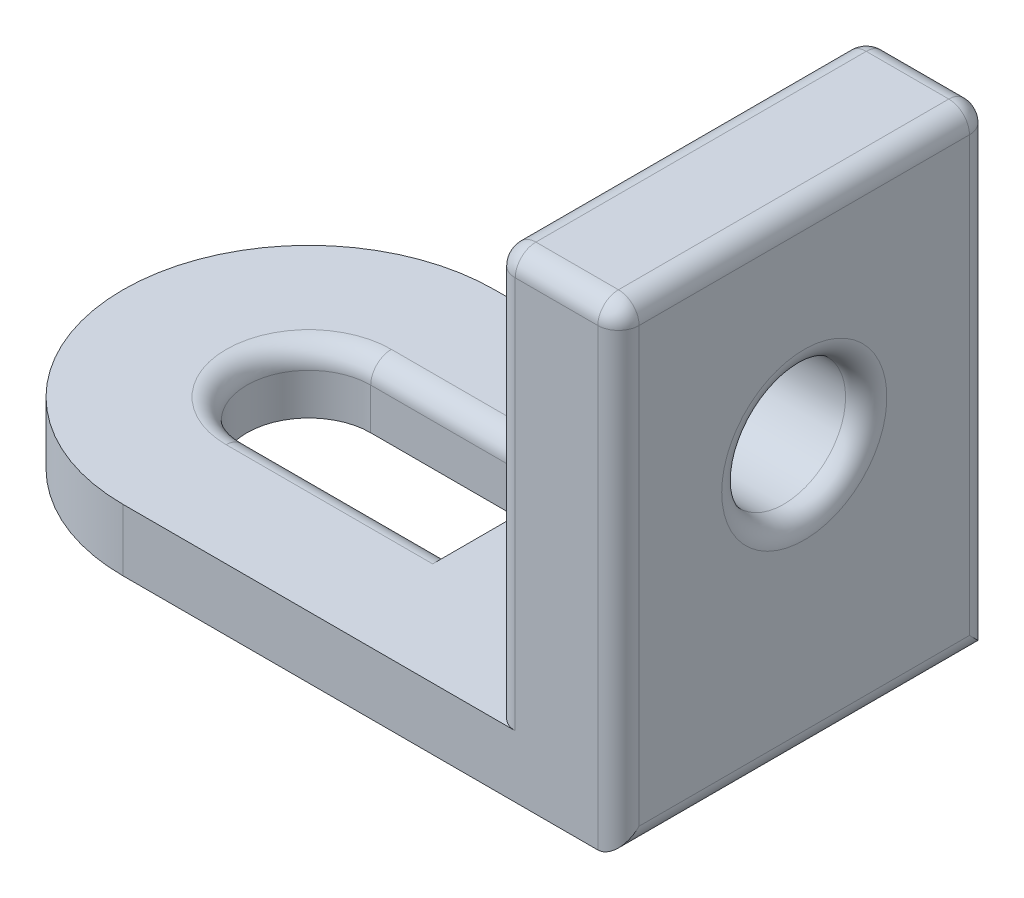
ISO-10303-21;
HEADER;
FILE_DESCRIPTION(('STEP AP214'),'2;1');
FILE_NAME('part.step','',(''),(''),'','','');
FILE_SCHEMA(('AUTOMOTIVE_DESIGN { 1 0 10303 214 1 1 1 1 }'));
ENDSEC;
DATA;
#1=APPLICATION_CONTEXT('core data for automotive mechanical design processes');
#2=APPLICATION_PROTOCOL_DEFINITION('international standard','automotive_design',2000,#1);
#3=PRODUCT_CONTEXT('',#1,'mechanical');
#4=PRODUCT('Part','Part','',(#3));
#5=PRODUCT_RELATED_PRODUCT_CATEGORY('part','',(#4));
#6=PRODUCT_DEFINITION_FORMATION('','',#4);
#7=PRODUCT_DEFINITION_CONTEXT('part definition',#1,'design');
#8=PRODUCT_DEFINITION('design','',#6,#7);
#9=PRODUCT_DEFINITION_SHAPE('','',#8);
#10=(LENGTH_UNIT() NAMED_UNIT(*) SI_UNIT(.MILLI.,.METRE.));
#11=(NAMED_UNIT(*) PLANE_ANGLE_UNIT() SI_UNIT($,.RADIAN.));
#12=(NAMED_UNIT(*) SI_UNIT($,.STERADIAN.) SOLID_ANGLE_UNIT());
#13=UNCERTAINTY_MEASURE_WITH_UNIT(LENGTH_MEASURE(1.E-05),#10,'distance_accuracy_value','');
#14=(GEOMETRIC_REPRESENTATION_CONTEXT(3) GLOBAL_UNCERTAINTY_ASSIGNED_CONTEXT((#13)) GLOBAL_UNIT_ASSIGNED_CONTEXT((#10,
#11,#12)) REPRESENTATION_CONTEXT('',''));
#15=CARTESIAN_POINT('',(0.,0.,0.));
#16=DIRECTION('',(0.,0.,1.));
#17=DIRECTION('',(1.,0.,0.));
#18=AXIS2_PLACEMENT_3D('',#15,#16,#17);
#19=CARTESIAN_POINT('',(24.,3.,-9.));
#20=DIRECTION('',(-1.,0.,0.));
#21=DIRECTION('',(0.,0.,1.));
#22=AXIS2_PLACEMENT_3D('',#19,#20,#21);
#23=PLANE('',#22);
#24=CARTESIAN_POINT('',(24.,13.,0.));
#25=DIRECTION('',(-1.,0.,0.));
#26=DIRECTION('',(0.,0.,1.));
#27=AXIS2_PLACEMENT_3D('',#24,#25,#26);
#28=CIRCLE('',#27,4.);
#29=CARTESIAN_POINT('',(24.,13.,4.));
#30=VERTEX_POINT('',#29);
#31=EDGE_CURVE('E11',#30,#30,#28,.T.);
#32=ORIENTED_EDGE('',*,*,#31,.T.);
#33=EDGE_LOOP('',(#32));
#34=FACE_BOUND('',#33,.T.);
#35=DIRECTION('',(0.,-1.,0.));
#36=VECTOR('',#35,1.);
#37=CARTESIAN_POINT('',(24.,3.,-8.));
#38=LINE('',#37,#36);
#39=CARTESIAN_POINT('',(24.,1.,-8.));
#40=VERTEX_POINT('',#39);
#41=CARTESIAN_POINT('',(24.,22.,-8.));
#42=VERTEX_POINT('',#41);
#43=EDGE_CURVE('E206',#40,#42,#38,.F.);
#44=ORIENTED_EDGE('',*,*,#43,.T.);
#45=DIRECTION('',(0.,0.,-1.));
#46=VECTOR('',#45,1.);
#47=CARTESIAN_POINT('',(24.,22.,-9.));
#48=LINE('',#47,#46);
#49=CARTESIAN_POINT('',(24.,22.,8.));
#50=VERTEX_POINT('',#49);
#51=EDGE_CURVE('E438',#42,#50,#48,.F.);
#52=ORIENTED_EDGE('',*,*,#51,.T.);
#53=DIRECTION('',(0.,-1.,0.));
#54=VECTOR('',#53,1.);
#55=CARTESIAN_POINT('',(24.,3.,8.));
#56=LINE('',#55,#54);
#57=CARTESIAN_POINT('',(24.,1.,8.));
#58=VERTEX_POINT('',#57);
#59=EDGE_CURVE('E230',#50,#58,#56,.T.);
#60=ORIENTED_EDGE('',*,*,#59,.T.);
#61=DIRECTION('',(0.,0.,-1.));
#62=VECTOR('',#61,1.);
#63=CARTESIAN_POINT('',(24.,1.,-9.));
#64=LINE('',#63,#62);
#65=EDGE_CURVE('E225',#58,#40,#64,.T.);
#66=ORIENTED_EDGE('',*,*,#65,.T.);
#67=EDGE_LOOP('',(#44,#52,#60,#66));
#68=FACE_BOUND('',#67,.T.);
#69=ADVANCED_FACE('F35',(#34,#68),#23,.F.);
#70=CARTESIAN_POINT('',(0.,3.,-9.));
#71=DIRECTION('',(0.,0.,1.));
#72=DIRECTION('',(1.,0.,0.));
#73=AXIS2_PLACEMENT_3D('',#70,#71,#72);
#74=PLANE('',#73);
#75=DIRECTION('',(-1.,0.,0.));
#76=VECTOR('',#75,1.);
#77=CARTESIAN_POINT('',(0.,3.,-9.));
#78=LINE('',#77,#76);
#79=CARTESIAN_POINT('',(19.,3.,-9.));
#80=VERTEX_POINT('',#79);
#81=CARTESIAN_POINT('',(0.,3.,-9.));
#82=VERTEX_POINT('',#81);
#83=EDGE_CURVE('E197',#80,#82,#78,.T.);
#84=ORIENTED_EDGE('',*,*,#83,.F.);
#85=DIRECTION('',(0.,-1.,0.));
#86=VECTOR('',#85,1.);
#87=CARTESIAN_POINT('',(19.,3.,-9.));
#88=LINE('',#87,#86);
#89=CARTESIAN_POINT('',(19.,22.,-9.));
#90=VERTEX_POINT('',#89);
#91=EDGE_CURVE('E473',#80,#90,#88,.F.);
#92=ORIENTED_EDGE('',*,*,#91,.T.);
#93=DIRECTION('',(-1.,0.,0.));
#94=VECTOR('',#93,1.);
#95=CARTESIAN_POINT('',(0.,22.,-9.));
#96=LINE('',#95,#94);
#97=CARTESIAN_POINT('',(23.,22.,-9.));
#98=VERTEX_POINT('',#97);
#99=EDGE_CURVE('E477',#90,#98,#96,.F.);
#100=ORIENTED_EDGE('',*,*,#99,.T.);
#101=DIRECTION('',(0.,-1.,0.));
#102=VECTOR('',#101,1.);
#103=CARTESIAN_POINT('',(23.,3.,-9.));
#104=LINE('',#103,#102);
#105=CARTESIAN_POINT('',(23.,0.,-9.));
#106=VERTEX_POINT('',#105);
#107=EDGE_CURVE('E239',#98,#106,#104,.T.);
#108=ORIENTED_EDGE('',*,*,#107,.T.);
#109=DIRECTION('',(-1.,0.,0.));
#110=VECTOR('',#109,1.);
#111=CARTESIAN_POINT('',(0.,0.,-9.));
#112=LINE('',#111,#110);
#113=CARTESIAN_POINT('',(0.,0.,-9.));
#114=VERTEX_POINT('',#113);
#115=EDGE_CURVE('E168',#106,#114,#112,.T.);
#116=ORIENTED_EDGE('',*,*,#115,.T.);
#117=DIRECTION('',(0.,-1.,0.));
#118=VECTOR('',#117,1.);
#119=CARTESIAN_POINT('',(0.,3.,-9.));
#120=LINE('',#119,#118);
#121=EDGE_CURVE('E201',#82,#114,#120,.T.);
#122=ORIENTED_EDGE('',*,*,#121,.F.);
#123=EDGE_LOOP('',(#84,#92,#100,#108,#116,#122));
#124=FACE_BOUND('',#123,.T.);
#125=ADVANCED_FACE('F322',(#124),#74,.F.);
#126=CARTESIAN_POINT('',(0.,3.,0.));
#127=DIRECTION('',(0.,-1.,0.));
#128=DIRECTION('',(0.,0.,-1.));
#129=AXIS2_PLACEMENT_3D('',#126,#127,#128);
#130=CYLINDRICAL_SURFACE('',#129,9.);
#131=CARTESIAN_POINT('',(0.,0.,0.));
#132=DIRECTION('',(0.,1.,0.));
#133=DIRECTION('',(0.,0.,1.));
#134=AXIS2_PLACEMENT_3D('',#131,#132,#133);
#135=CIRCLE('',#134,9.);
#136=CARTESIAN_POINT('',(0.,0.,9.));
#137=VERTEX_POINT('',#136);
#138=EDGE_CURVE('E211',#114,#137,#135,.T.);
#139=ORIENTED_EDGE('',*,*,#138,.T.);
#140=DIRECTION('',(0.,-1.,0.));
#141=VECTOR('',#140,1.);
#142=CARTESIAN_POINT('',(0.,3.,9.));
#143=LINE('',#142,#141);
#144=CARTESIAN_POINT('',(0.,3.,9.));
#145=VERTEX_POINT('',#144);
#146=EDGE_CURVE('E205',#145,#137,#143,.T.);
#147=ORIENTED_EDGE('',*,*,#146,.F.);
#148=CARTESIAN_POINT('',(0.,3.,0.));
#149=DIRECTION('',(0.,1.,0.));
#150=DIRECTION('',(0.,0.,1.));
#151=AXIS2_PLACEMENT_3D('',#148,#149,#150);
#152=CIRCLE('',#151,9.);
#153=EDGE_CURVE('E194',#82,#145,#152,.T.);
#154=ORIENTED_EDGE('',*,*,#153,.F.);
#155=ORIENTED_EDGE('',*,*,#121,.T.);
#156=EDGE_LOOP('',(#139,#147,#154,#155));
#157=FACE_BOUND('',#156,.T.);
#158=ADVANCED_FACE('F329',(#157),#130,.T.);
#159=CARTESIAN_POINT('',(0.,3.,9.));
#160=DIRECTION('',(0.,0.,-1.));
#161=DIRECTION('',(-1.,0.,0.));
#162=AXIS2_PLACEMENT_3D('',#159,#160,#161);
#163=PLANE('',#162);
#164=DIRECTION('',(0.,-1.,0.));
#165=VECTOR('',#164,1.);
#166=CARTESIAN_POINT('',(19.,3.,9.));
#167=LINE('',#166,#165);
#168=CARTESIAN_POINT('',(19.,22.,9.));
#169=VERTEX_POINT('',#168);
#170=CARTESIAN_POINT('',(19.,3.,9.));
#171=VERTEX_POINT('',#170);
#172=EDGE_CURVE('E254',#169,#171,#167,.T.);
#173=ORIENTED_EDGE('',*,*,#172,.T.);
#174=DIRECTION('',(1.,0.,0.));
#175=VECTOR('',#174,1.);
#176=CARTESIAN_POINT('',(0.,3.,9.));
#177=LINE('',#176,#175);
#178=EDGE_CURVE('E203',#145,#171,#177,.T.);
#179=ORIENTED_EDGE('',*,*,#178,.F.);
#180=ORIENTED_EDGE('',*,*,#146,.T.);
#181=DIRECTION('',(1.,0.,0.));
#182=VECTOR('',#181,1.);
#183=CARTESIAN_POINT('',(0.,0.,9.));
#184=LINE('',#183,#182);
#185=CARTESIAN_POINT('',(23.,0.,9.));
#186=VERTEX_POINT('',#185);
#187=EDGE_CURVE('E200',#137,#186,#184,.T.);
#188=ORIENTED_EDGE('',*,*,#187,.T.);
#189=DIRECTION('',(0.,-1.,0.));
#190=VECTOR('',#189,1.);
#191=CARTESIAN_POINT('',(23.,3.,9.));
#192=LINE('',#191,#190);
#193=CARTESIAN_POINT('',(23.,22.,9.));
#194=VERTEX_POINT('',#193);
#195=EDGE_CURVE('E236',#186,#194,#192,.F.);
#196=ORIENTED_EDGE('',*,*,#195,.T.);
#197=DIRECTION('',(1.,0.,0.));
#198=VECTOR('',#197,1.);
#199=CARTESIAN_POINT('',(0.,22.,9.));
#200=LINE('',#199,#198);
#201=EDGE_CURVE('E252',#194,#169,#200,.F.);
#202=ORIENTED_EDGE('',*,*,#201,.T.);
#203=EDGE_LOOP('',(#173,#179,#180,#188,#196,#202));
#204=FACE_BOUND('',#203,.T.);
#205=ADVANCED_FACE('F403',(#204),#163,.F.);
#206=CARTESIAN_POINT('',(0.,3.,0.));
#207=DIRECTION('',(0.,1.,0.));
#208=DIRECTION('',(0.,0.,1.));
#209=AXIS2_PLACEMENT_3D('',#206,#207,#208);
#210=PLANE('',#209);
#211=DIRECTION('',(0.,0.,1.));
#212=VECTOR('',#211,1.);
#213=CARTESIAN_POINT('',(18.,3.,-9.));
#214=LINE('',#213,#212);
#215=CARTESIAN_POINT('',(18.,3.,-8.));
#216=VERTEX_POINT('',#215);
#217=CARTESIAN_POINT('',(18.,3.,8.));
#218=VERTEX_POINT('',#217);
#219=EDGE_CURVE('E185',#216,#218,#214,.T.);
#220=ORIENTED_EDGE('',*,*,#219,.F.);
#221=CARTESIAN_POINT('',(19.,3.,-8.));
#222=DIRECTION('',(0.,1.,0.));
#223=DIRECTION('',(0.,0.,1.));
#224=AXIS2_PLACEMENT_3D('',#221,#222,#223);
#225=CIRCLE('',#224,1.);
#226=EDGE_CURVE('E281',#216,#80,#225,.F.);
#227=ORIENTED_EDGE('',*,*,#226,.T.);
#228=ORIENTED_EDGE('',*,*,#83,.T.);
#229=ORIENTED_EDGE('',*,*,#153,.T.);
#230=ORIENTED_EDGE('',*,*,#178,.T.);
#231=CARTESIAN_POINT('',(19.,3.,8.));
#232=DIRECTION('',(0.,1.,0.));
#233=DIRECTION('',(0.,0.,1.));
#234=AXIS2_PLACEMENT_3D('',#231,#232,#233);
#235=CIRCLE('',#234,1.);
#236=EDGE_CURVE('E286',#171,#218,#235,.F.);
#237=ORIENTED_EDGE('',*,*,#236,.T.);
#238=EDGE_LOOP('',(#220,#227,#228,#229,#230,#237));
#239=FACE_BOUND('',#238,.T.);
#240=DIRECTION('',(-1.,0.,0.));
#241=VECTOR('',#240,1.);
#242=CARTESIAN_POINT('',(10.,3.,-4.));
#243=LINE('',#242,#241);
#244=CARTESIAN_POINT('',(0.,3.,-4.));
#245=VERTEX_POINT('',#244);
#246=CARTESIAN_POINT('',(10.,3.,-4.));
#247=VERTEX_POINT('',#246);
#248=EDGE_CURVE('E292',#245,#247,#243,.F.);
#249=ORIENTED_EDGE('',*,*,#248,.T.);
#250=DIRECTION('',(0.,0.,-1.));
#251=VECTOR('',#250,1.);
#252=CARTESIAN_POINT('',(10.,3.,-3.));
#253=LINE('',#252,#251);
#254=CARTESIAN_POINT('',(10.,3.,4.));
#255=VERTEX_POINT('',#254);
#256=EDGE_CURVE('E173',#255,#247,#253,.T.);
#257=ORIENTED_EDGE('',*,*,#256,.F.);
#258=DIRECTION('',(1.,0.,0.));
#259=VECTOR('',#258,1.);
#260=CARTESIAN_POINT('',(0.,3.,4.));
#261=LINE('',#260,#259);
#262=CARTESIAN_POINT('',(0.,3.,4.));
#263=VERTEX_POINT('',#262);
#264=EDGE_CURVE('E283',#255,#263,#261,.F.);
#265=ORIENTED_EDGE('',*,*,#264,.T.);
#266=CARTESIAN_POINT('',(0.,3.,0.));
#267=DIRECTION('',(0.,1.,0.));
#268=DIRECTION('',(0.,0.,1.));
#269=AXIS2_PLACEMENT_3D('',#266,#267,#268);
#270=CIRCLE('',#269,4.);
#271=EDGE_CURVE('E280',#263,#245,#270,.F.);
#272=ORIENTED_EDGE('',*,*,#271,.T.);
#273=EDGE_LOOP('',(#249,#257,#265,#272));
#274=FACE_BOUND('',#273,.T.);
#275=ADVANCED_FACE('F400',(#239,#274),#210,.T.);
#276=CARTESIAN_POINT('',(0.,0.,0.));
#277=DIRECTION('',(0.,1.,0.));
#278=DIRECTION('',(0.,0.,1.));
#279=AXIS2_PLACEMENT_3D('',#276,#277,#278);
#280=PLANE('',#279);
#281=DIRECTION('',(1.,0.,0.));
#282=VECTOR('',#281,1.);
#283=CARTESIAN_POINT('',(0.,0.,-3.));
#284=LINE('',#283,#282);
#285=CARTESIAN_POINT('',(0.,0.,-3.));
#286=VERTEX_POINT('',#285);
#287=CARTESIAN_POINT('',(10.,0.,-3.));
#288=VERTEX_POINT('',#287);
#289=EDGE_CURVE('E178',#286,#288,#284,.T.);
#290=ORIENTED_EDGE('',*,*,#289,.F.);
#291=CARTESIAN_POINT('',(0.,0.,0.));
#292=DIRECTION('',(0.,1.,0.));
#293=DIRECTION('',(0.,0.,1.));
#294=AXIS2_PLACEMENT_3D('',#291,#292,#293);
#295=CIRCLE('',#294,3.);
#296=CARTESIAN_POINT('',(0.,0.,3.));
#297=VERTEX_POINT('',#296);
#298=EDGE_CURVE('E169',#297,#286,#295,.F.);
#299=ORIENTED_EDGE('',*,*,#298,.F.);
#300=DIRECTION('',(-1.,0.,0.));
#301=VECTOR('',#300,1.);
#302=CARTESIAN_POINT('',(0.,0.,3.));
#303=LINE('',#302,#301);
#304=CARTESIAN_POINT('',(10.,0.,3.));
#305=VERTEX_POINT('',#304);
#306=EDGE_CURVE('E160',#305,#297,#303,.T.);
#307=ORIENTED_EDGE('',*,*,#306,.F.);
#308=DIRECTION('',(0.,0.,1.));
#309=VECTOR('',#308,1.);
#310=CARTESIAN_POINT('',(10.,0.,-3.));
#311=LINE('',#310,#309);
#312=EDGE_CURVE('E180',#288,#305,#311,.T.);
#313=ORIENTED_EDGE('',*,*,#312,.F.);
#314=EDGE_LOOP('',(#290,#299,#307,#313));
#315=FACE_BOUND('',#314,.T.);
#316=ORIENTED_EDGE('',*,*,#115,.F.);
#317=DIRECTION('',(0.,0.,-1.));
#318=VECTOR('',#317,1.);
#319=CARTESIAN_POINT('',(23.,0.,0.));
#320=LINE('',#319,#318);
#321=EDGE_CURVE('E232',#106,#186,#320,.F.);
#322=ORIENTED_EDGE('',*,*,#321,.T.);
#323=ORIENTED_EDGE('',*,*,#187,.F.);
#324=ORIENTED_EDGE('',*,*,#138,.F.);
#325=EDGE_LOOP('',(#316,#322,#323,#324));
#326=FACE_BOUND('',#325,.T.);
#327=ADVANCED_FACE('F176',(#315,#326),#280,.F.);
#328=CARTESIAN_POINT('',(0.,-14.3178210632764,0.));
#329=DIRECTION('',(0.,1.,0.));
#330=DIRECTION('',(0.,0.,1.));
#331=AXIS2_PLACEMENT_3D('',#328,#329,#330);
#332=CYLINDRICAL_SURFACE('',#331,3.);
#333=DIRECTION('',(0.,1.,0.));
#334=VECTOR('',#333,1.);
#335=CARTESIAN_POINT('',(0.,-14.3178210632764,-3.));
#336=LINE('',#335,#334);
#337=CARTESIAN_POINT('',(0.,2.,-3.));
#338=VERTEX_POINT('',#337);
#339=EDGE_CURVE('E186',#286,#338,#336,.T.);
#340=ORIENTED_EDGE('',*,*,#339,.T.);
#341=CARTESIAN_POINT('',(0.,2.,0.));
#342=DIRECTION('',(0.,1.,0.));
#343=DIRECTION('',(0.,0.,1.));
#344=AXIS2_PLACEMENT_3D('',#341,#342,#343);
#345=CIRCLE('',#344,3.);
#346=CARTESIAN_POINT('',(0.,2.,3.));
#347=VERTEX_POINT('',#346);
#348=EDGE_CURVE('E58',#338,#347,#345,.T.);
#349=ORIENTED_EDGE('',*,*,#348,.T.);
#350=DIRECTION('',(0.,1.,0.));
#351=VECTOR('',#350,1.);
#352=CARTESIAN_POINT('',(0.,-14.3178210632764,3.));
#353=LINE('',#352,#351);
#354=EDGE_CURVE('E162',#297,#347,#353,.T.);
#355=ORIENTED_EDGE('',*,*,#354,.F.);
#356=ORIENTED_EDGE('',*,*,#298,.T.);
#357=EDGE_LOOP('',(#340,#349,#355,#356));
#358=FACE_BOUND('',#357,.T.);
#359=ADVANCED_FACE('F171',(#358),#332,.F.);
#360=CARTESIAN_POINT('',(0.,-14.3178210632764,-3.));
#361=DIRECTION('',(0.,0.,-1.));
#362=DIRECTION('',(-1.,0.,0.));
#363=AXIS2_PLACEMENT_3D('',#360,#361,#362);
#364=PLANE('',#363);
#365=DIRECTION('',(0.,1.,0.));
#366=VECTOR('',#365,1.);
#367=CARTESIAN_POINT('',(10.,-14.3178210632764,-3.));
#368=LINE('',#367,#366);
#369=CARTESIAN_POINT('',(10.,2.,-3.));
#370=VERTEX_POINT('',#369);
#371=EDGE_CURVE('E188',#288,#370,#368,.T.);
#372=ORIENTED_EDGE('',*,*,#371,.T.);
#373=DIRECTION('',(-1.,0.,0.));
#374=VECTOR('',#373,1.);
#375=CARTESIAN_POINT('',(0.,2.,-3.));
#376=LINE('',#375,#374);
#377=EDGE_CURVE('E274',#370,#338,#376,.T.);
#378=ORIENTED_EDGE('',*,*,#377,.T.);
#379=ORIENTED_EDGE('',*,*,#339,.F.);
#380=ORIENTED_EDGE('',*,*,#289,.T.);
#381=EDGE_LOOP('',(#372,#378,#379,#380));
#382=FACE_BOUND('',#381,.T.);
#383=ADVANCED_FACE('F273',(#382),#364,.F.);
#384=CARTESIAN_POINT('',(10.,-14.3178210632764,-3.));
#385=DIRECTION('',(1.,0.,0.));
#386=DIRECTION('',(0.,0.,-1.));
#387=AXIS2_PLACEMENT_3D('',#384,#385,#386);
#388=PLANE('',#387);
#389=ORIENTED_EDGE('',*,*,#312,.T.);
#390=DIRECTION('',(0.,1.,0.));
#391=VECTOR('',#390,1.);
#392=CARTESIAN_POINT('',(10.,-14.3178210632764,3.));
#393=LINE('',#392,#391);
#394=CARTESIAN_POINT('',(10.,2.,3.));
#395=VERTEX_POINT('',#394);
#396=EDGE_CURVE('E163',#305,#395,#393,.T.);
#397=ORIENTED_EDGE('',*,*,#396,.T.);
#398=CARTESIAN_POINT('',(10.,2.,4.));
#399=DIRECTION('',(1.,0.,0.));
#400=DIRECTION('',(0.,0.,-1.));
#401=AXIS2_PLACEMENT_3D('',#398,#399,#400);
#402=CIRCLE('',#401,1.);
#403=EDGE_CURVE('E298',#395,#255,#402,.T.);
#404=ORIENTED_EDGE('',*,*,#403,.T.);
#405=ORIENTED_EDGE('',*,*,#256,.T.);
#406=CARTESIAN_POINT('',(10.,2.,-4.));
#407=DIRECTION('',(1.,0.,0.));
#408=DIRECTION('',(0.,0.,-1.));
#409=AXIS2_PLACEMENT_3D('',#406,#407,#408);
#410=CIRCLE('',#409,1.);
#411=EDGE_CURVE('E269',#247,#370,#410,.T.);
#412=ORIENTED_EDGE('',*,*,#411,.T.);
#413=ORIENTED_EDGE('',*,*,#371,.F.);
#414=EDGE_LOOP('',(#389,#397,#404,#405,#412,#413));
#415=FACE_BOUND('',#414,.T.);
#416=ADVANCED_FACE('F265',(#415),#388,.F.);
#417=CARTESIAN_POINT('',(0.,-14.3178210632764,3.));
#418=DIRECTION('',(0.,0.,1.));
#419=DIRECTION('',(1.,0.,0.));
#420=AXIS2_PLACEMENT_3D('',#417,#418,#419);
#421=PLANE('',#420);
#422=ORIENTED_EDGE('',*,*,#354,.T.);
#423=DIRECTION('',(1.,0.,0.));
#424=VECTOR('',#423,1.);
#425=CARTESIAN_POINT('',(10.,2.,3.));
#426=LINE('',#425,#424);
#427=EDGE_CURVE('E50',#347,#395,#426,.T.);
#428=ORIENTED_EDGE('',*,*,#427,.T.);
#429=ORIENTED_EDGE('',*,*,#396,.F.);
#430=ORIENTED_EDGE('',*,*,#306,.T.);
#431=EDGE_LOOP('',(#422,#428,#429,#430));
#432=FACE_BOUND('',#431,.T.);
#433=ADVANCED_FACE('F161',(#432),#421,.F.);
#434=CARTESIAN_POINT('',(18.,23.,-9.));
#435=DIRECTION('',(1.,0.,0.));
#436=DIRECTION('',(0.,0.,-1.));
#437=AXIS2_PLACEMENT_3D('',#434,#435,#436);
#438=PLANE('',#437);
#439=CARTESIAN_POINT('',(18.,13.,0.));
#440=DIRECTION('',(1.,0.,0.));
#441=DIRECTION('',(0.,0.,-1.));
#442=AXIS2_PLACEMENT_3D('',#439,#440,#441);
#443=CIRCLE('',#442,3.);
#444=CARTESIAN_POINT('',(18.,13.,-3.));
#445=VERTEX_POINT('',#444);
#446=EDGE_CURVE('E302',#445,#445,#443,.T.);
#447=ORIENTED_EDGE('',*,*,#446,.T.);
#448=EDGE_LOOP('',(#447));
#449=FACE_BOUND('',#448,.T.);
#450=ORIENTED_EDGE('',*,*,#219,.T.);
#451=DIRECTION('',(0.,-1.,0.));
#452=VECTOR('',#451,1.);
#453=CARTESIAN_POINT('',(18.,23.,8.));
#454=LINE('',#453,#452);
#455=CARTESIAN_POINT('',(18.,22.,8.));
#456=VERTEX_POINT('',#455);
#457=EDGE_CURVE('E476',#218,#456,#454,.F.);
#458=ORIENTED_EDGE('',*,*,#457,.T.);
#459=DIRECTION('',(0.,0.,1.));
#460=VECTOR('',#459,1.);
#461=CARTESIAN_POINT('',(18.,22.,-9.));
#462=LINE('',#461,#460);
#463=CARTESIAN_POINT('',(18.,22.,-8.));
#464=VERTEX_POINT('',#463);
#465=EDGE_CURVE('E257',#456,#464,#462,.F.);
#466=ORIENTED_EDGE('',*,*,#465,.T.);
#467=DIRECTION('',(0.,-1.,0.));
#468=VECTOR('',#467,1.);
#469=CARTESIAN_POINT('',(18.,23.,-8.));
#470=LINE('',#469,#468);
#471=EDGE_CURVE('E474',#464,#216,#470,.T.);
#472=ORIENTED_EDGE('',*,*,#471,.T.);
#473=EDGE_LOOP('',(#450,#458,#466,#472));
#474=FACE_BOUND('',#473,.T.);
#475=ADVANCED_FACE('F489',(#449,#474),#438,.F.);
#476=CARTESIAN_POINT('',(0.,23.,0.));
#477=DIRECTION('',(0.,-1.,0.));
#478=DIRECTION('',(0.,0.,-1.));
#479=AXIS2_PLACEMENT_3D('',#476,#477,#478);
#480=PLANE('',#479);
#481=DIRECTION('',(-1.,0.,0.));
#482=VECTOR('',#481,1.);
#483=CARTESIAN_POINT('',(0.,23.,-8.));
#484=LINE('',#483,#482);
#485=CARTESIAN_POINT('',(23.,23.,-8.));
#486=VERTEX_POINT('',#485);
#487=CARTESIAN_POINT('',(19.,23.,-8.));
#488=VERTEX_POINT('',#487);
#489=EDGE_CURVE('E444',#486,#488,#484,.T.);
#490=ORIENTED_EDGE('',*,*,#489,.T.);
#491=DIRECTION('',(0.,0.,1.));
#492=VECTOR('',#491,1.);
#493=CARTESIAN_POINT('',(19.,23.,0.));
#494=LINE('',#493,#492);
#495=CARTESIAN_POINT('',(19.,23.,8.));
#496=VERTEX_POINT('',#495);
#497=EDGE_CURVE('E440',#488,#496,#494,.T.);
#498=ORIENTED_EDGE('',*,*,#497,.T.);
#499=DIRECTION('',(1.,0.,0.));
#500=VECTOR('',#499,1.);
#501=CARTESIAN_POINT('',(0.,23.,8.));
#502=LINE('',#501,#500);
#503=CARTESIAN_POINT('',(23.,23.,8.));
#504=VERTEX_POINT('',#503);
#505=EDGE_CURVE('E484',#496,#504,#502,.T.);
#506=ORIENTED_EDGE('',*,*,#505,.T.);
#507=DIRECTION('',(0.,0.,-1.));
#508=VECTOR('',#507,1.);
#509=CARTESIAN_POINT('',(23.,23.,0.));
#510=LINE('',#509,#508);
#511=EDGE_CURVE('E482',#504,#486,#510,.T.);
#512=ORIENTED_EDGE('',*,*,#511,.T.);
#513=EDGE_LOOP('',(#490,#498,#506,#512));
#514=FACE_BOUND('',#513,.T.);
#515=ADVANCED_FACE('F346',(#514),#480,.F.);
#516=CARTESIAN_POINT('',(23.,3.,8.));
#517=DIRECTION('',(0.,-1.,0.));
#518=DIRECTION('',(0.,0.,-1.));
#519=AXIS2_PLACEMENT_3D('',#516,#517,#518);
#520=CYLINDRICAL_SURFACE('',#519,1.);
#521=ORIENTED_EDGE('',*,*,#59,.F.);
#522=CARTESIAN_POINT('',(23.,22.,8.));
#523=DIRECTION('',(0.,-1.,0.));
#524=DIRECTION('',(0.,0.,-1.));
#525=AXIS2_PLACEMENT_3D('',#522,#523,#524);
#526=CIRCLE('',#525,1.);
#527=EDGE_CURVE('E241',#50,#194,#526,.T.);
#528=ORIENTED_EDGE('',*,*,#527,.T.);
#529=ORIENTED_EDGE('',*,*,#195,.F.);
#530=CARTESIAN_POINT('',(23.,1.,8.));
#531=DIRECTION('',(0.,-0.707106781186547,-0.707106781186547));
#532=DIRECTION('',(0.,-0.707106781186547,0.707106781186547));
#533=AXIS2_PLACEMENT_3D('',#530,#531,#532);
#534=ELLIPSE('',#533,1.41421356237309,1.);
#535=EDGE_CURVE('E244',#58,#186,#534,.T.);
#536=ORIENTED_EDGE('',*,*,#535,.F.);
#537=EDGE_LOOP('',(#521,#528,#529,#536));
#538=FACE_BOUND('',#537,.T.);
#539=ADVANCED_FACE('F342',(#538),#520,.T.);
#540=CARTESIAN_POINT('',(23.,3.,-8.));
#541=DIRECTION('',(0.,-1.,0.));
#542=DIRECTION('',(0.,0.,-1.));
#543=AXIS2_PLACEMENT_3D('',#540,#541,#542);
#544=CYLINDRICAL_SURFACE('',#543,1.);
#545=ORIENTED_EDGE('',*,*,#107,.F.);
#546=CARTESIAN_POINT('',(23.,22.,-8.));
#547=DIRECTION('',(0.,-1.,0.));
#548=DIRECTION('',(0.,0.,-1.));
#549=AXIS2_PLACEMENT_3D('',#546,#547,#548);
#550=CIRCLE('',#549,1.);
#551=EDGE_CURVE('E250',#98,#42,#550,.T.);
#552=ORIENTED_EDGE('',*,*,#551,.T.);
#553=ORIENTED_EDGE('',*,*,#43,.F.);
#554=CARTESIAN_POINT('',(23.,1.,-8.));
#555=DIRECTION('',(0.,-0.707106781186547,0.707106781186547));
#556=DIRECTION('',(0.,-0.707106781186547,-0.707106781186547));
#557=AXIS2_PLACEMENT_3D('',#554,#555,#556);
#558=ELLIPSE('',#557,1.41421356237309,1.);
#559=EDGE_CURVE('E242',#106,#40,#558,.T.);
#560=ORIENTED_EDGE('',*,*,#559,.F.);
#561=EDGE_LOOP('',(#545,#552,#553,#560));
#562=FACE_BOUND('',#561,.T.);
#563=ADVANCED_FACE('F338',(#562),#544,.T.);
#564=CARTESIAN_POINT('',(23.,1.,-9.));
#565=DIRECTION('',(0.,0.,-1.));
#566=DIRECTION('',(-1.,0.,0.));
#567=AXIS2_PLACEMENT_3D('',#564,#565,#566);
#568=CYLINDRICAL_SURFACE('',#567,1.);
#569=ORIENTED_EDGE('',*,*,#535,.T.);
#570=ORIENTED_EDGE('',*,*,#321,.F.);
#571=ORIENTED_EDGE('',*,*,#559,.T.);
#572=ORIENTED_EDGE('',*,*,#65,.F.);
#573=EDGE_LOOP('',(#569,#570,#571,#572));
#574=FACE_BOUND('',#573,.T.);
#575=ADVANCED_FACE('F334',(#574),#568,.T.);
#576=CARTESIAN_POINT('',(19.,23.,-8.));
#577=DIRECTION('',(0.,-1.,0.));
#578=DIRECTION('',(0.,0.,-1.));
#579=AXIS2_PLACEMENT_3D('',#576,#577,#578);
#580=CYLINDRICAL_SURFACE('',#579,1.);
#581=CARTESIAN_POINT('',(19.,22.,-8.));
#582=DIRECTION('',(0.,1.,0.));
#583=DIRECTION('',(0.,0.,1.));
#584=AXIS2_PLACEMENT_3D('',#581,#582,#583);
#585=CIRCLE('',#584,1.);
#586=EDGE_CURVE('E245',#90,#464,#585,.T.);
#587=ORIENTED_EDGE('',*,*,#586,.F.);
#588=ORIENTED_EDGE('',*,*,#91,.F.);
#589=ORIENTED_EDGE('',*,*,#226,.F.);
#590=ORIENTED_EDGE('',*,*,#471,.F.);
#591=EDGE_LOOP('',(#587,#588,#589,#590));
#592=FACE_BOUND('',#591,.T.);
#593=ADVANCED_FACE('F337',(#592),#580,.T.);
#594=CARTESIAN_POINT('',(19.,22.,-8.));
#595=DIRECTION('',(0.,0.,1.));
#596=DIRECTION('',(1.,0.,0.));
#597=AXIS2_PLACEMENT_3D('',#594,#595,#596);
#598=SPHERICAL_SURFACE('',#597,1.);
#599=CARTESIAN_POINT('',(19.,22.,-8.));
#600=DIRECTION('',(-1.,0.,0.));
#601=DIRECTION('',(0.,0.,1.));
#602=AXIS2_PLACEMENT_3D('',#599,#600,#601);
#603=CIRCLE('',#602,1.);
#604=EDGE_CURVE('E459',#90,#488,#603,.F.);
#605=ORIENTED_EDGE('',*,*,#604,.F.);
#606=ORIENTED_EDGE('',*,*,#586,.T.);
#607=CARTESIAN_POINT('',(19.,22.,-8.));
#608=DIRECTION('',(0.,0.,-1.));
#609=DIRECTION('',(-1.,0.,0.));
#610=AXIS2_PLACEMENT_3D('',#607,#608,#609);
#611=CIRCLE('',#610,1.);
#612=EDGE_CURVE('E461',#488,#464,#611,.F.);
#613=ORIENTED_EDGE('',*,*,#612,.F.);
#614=EDGE_LOOP('',(#605,#606,#613));
#615=FACE_BOUND('',#614,.T.);
#616=ADVANCED_FACE('F380',(#615),#598,.T.);
#617=CARTESIAN_POINT('',(19.,3.,8.));
#618=DIRECTION('',(0.,-1.,0.));
#619=DIRECTION('',(0.,0.,-1.));
#620=AXIS2_PLACEMENT_3D('',#617,#618,#619);
#621=CYLINDRICAL_SURFACE('',#620,1.);
#622=ORIENTED_EDGE('',*,*,#236,.F.);
#623=ORIENTED_EDGE('',*,*,#172,.F.);
#624=CARTESIAN_POINT('',(19.,22.,8.));
#625=DIRECTION('',(0.,1.,0.));
#626=DIRECTION('',(0.,0.,1.));
#627=AXIS2_PLACEMENT_3D('',#624,#625,#626);
#628=CIRCLE('',#627,1.);
#629=EDGE_CURVE('E456',#456,#169,#628,.T.);
#630=ORIENTED_EDGE('',*,*,#629,.F.);
#631=ORIENTED_EDGE('',*,*,#457,.F.);
#632=EDGE_LOOP('',(#622,#623,#630,#631));
#633=FACE_BOUND('',#632,.T.);
#634=ADVANCED_FACE('F376',(#633),#621,.T.);
#635=CARTESIAN_POINT('',(19.,22.,0.));
#636=DIRECTION('',(0.,0.,1.));
#637=DIRECTION('',(1.,0.,0.));
#638=AXIS2_PLACEMENT_3D('',#635,#636,#637);
#639=CYLINDRICAL_SURFACE('',#638,1.);
#640=ORIENTED_EDGE('',*,*,#612,.T.);
#641=ORIENTED_EDGE('',*,*,#465,.F.);
#642=CARTESIAN_POINT('',(19.,22.,8.));
#643=DIRECTION('',(0.,0.,1.));
#644=DIRECTION('',(1.,0.,0.));
#645=AXIS2_PLACEMENT_3D('',#642,#643,#644);
#646=CIRCLE('',#645,1.);
#647=EDGE_CURVE('E453',#496,#456,#646,.T.);
#648=ORIENTED_EDGE('',*,*,#647,.F.);
#649=ORIENTED_EDGE('',*,*,#497,.F.);
#650=EDGE_LOOP('',(#640,#641,#648,#649));
#651=FACE_BOUND('',#650,.T.);
#652=ADVANCED_FACE('F372',(#651),#639,.T.);
#653=CARTESIAN_POINT('',(0.,22.,-8.));
#654=DIRECTION('',(-1.,0.,0.));
#655=DIRECTION('',(0.,0.,1.));
#656=AXIS2_PLACEMENT_3D('',#653,#654,#655);
#657=CYLINDRICAL_SURFACE('',#656,1.);
#658=ORIENTED_EDGE('',*,*,#604,.T.);
#659=ORIENTED_EDGE('',*,*,#489,.F.);
#660=CARTESIAN_POINT('',(23.,22.,-8.));
#661=DIRECTION('',(1.,0.,0.));
#662=DIRECTION('',(0.,0.,-1.));
#663=AXIS2_PLACEMENT_3D('',#660,#661,#662);
#664=CIRCLE('',#663,1.);
#665=EDGE_CURVE('E429',#98,#486,#664,.T.);
#666=ORIENTED_EDGE('',*,*,#665,.F.);
#667=ORIENTED_EDGE('',*,*,#99,.F.);
#668=EDGE_LOOP('',(#658,#659,#666,#667));
#669=FACE_BOUND('',#668,.T.);
#670=ADVANCED_FACE('F368',(#669),#657,.T.);
#671=CARTESIAN_POINT('',(19.,22.,8.));
#672=DIRECTION('',(0.,0.,1.));
#673=DIRECTION('',(1.,0.,0.));
#674=AXIS2_PLACEMENT_3D('',#671,#672,#673);
#675=SPHERICAL_SURFACE('',#674,1.);
#676=ORIENTED_EDGE('',*,*,#647,.T.);
#677=ORIENTED_EDGE('',*,*,#629,.T.);
#678=CARTESIAN_POINT('',(19.,22.,8.));
#679=DIRECTION('',(-1.,0.,0.));
#680=DIRECTION('',(0.,0.,1.));
#681=AXIS2_PLACEMENT_3D('',#678,#679,#680);
#682=CIRCLE('',#681,1.);
#683=EDGE_CURVE('E434',#496,#169,#682,.F.);
#684=ORIENTED_EDGE('',*,*,#683,.F.);
#685=EDGE_LOOP('',(#676,#677,#684));
#686=FACE_BOUND('',#685,.T.);
#687=ADVANCED_FACE('F364',(#686),#675,.T.);
#688=CARTESIAN_POINT('',(23.,22.,-8.));
#689=DIRECTION('',(0.,0.,1.));
#690=DIRECTION('',(1.,0.,0.));
#691=AXIS2_PLACEMENT_3D('',#688,#689,#690);
#692=SPHERICAL_SURFACE('',#691,1.);
#693=ORIENTED_EDGE('',*,*,#551,.F.);
#694=ORIENTED_EDGE('',*,*,#665,.T.);
#695=CARTESIAN_POINT('',(23.,22.,-8.));
#696=DIRECTION('',(0.,0.,1.));
#697=DIRECTION('',(1.,0.,0.));
#698=AXIS2_PLACEMENT_3D('',#695,#696,#697);
#699=CIRCLE('',#698,1.);
#700=EDGE_CURVE('E431',#42,#486,#699,.T.);
#701=ORIENTED_EDGE('',*,*,#700,.F.);
#702=EDGE_LOOP('',(#693,#694,#701));
#703=FACE_BOUND('',#702,.T.);
#704=ADVANCED_FACE('F360',(#703),#692,.T.);
#705=CARTESIAN_POINT('',(0.,22.,8.));
#706=DIRECTION('',(1.,0.,0.));
#707=DIRECTION('',(0.,0.,-1.));
#708=AXIS2_PLACEMENT_3D('',#705,#706,#707);
#709=CYLINDRICAL_SURFACE('',#708,1.);
#710=ORIENTED_EDGE('',*,*,#683,.T.);
#711=ORIENTED_EDGE('',*,*,#201,.F.);
#712=CARTESIAN_POINT('',(23.,22.,8.));
#713=DIRECTION('',(1.,0.,0.));
#714=DIRECTION('',(0.,0.,-1.));
#715=AXIS2_PLACEMENT_3D('',#712,#713,#714);
#716=CIRCLE('',#715,1.);
#717=EDGE_CURVE('E435',#504,#194,#716,.T.);
#718=ORIENTED_EDGE('',*,*,#717,.F.);
#719=ORIENTED_EDGE('',*,*,#505,.F.);
#720=EDGE_LOOP('',(#710,#711,#718,#719));
#721=FACE_BOUND('',#720,.T.);
#722=ADVANCED_FACE('F356',(#721),#709,.T.);
#723=CARTESIAN_POINT('',(23.,22.,0.));
#724=DIRECTION('',(0.,0.,-1.));
#725=DIRECTION('',(-1.,0.,0.));
#726=AXIS2_PLACEMENT_3D('',#723,#724,#725);
#727=CYLINDRICAL_SURFACE('',#726,1.);
#728=ORIENTED_EDGE('',*,*,#700,.T.);
#729=ORIENTED_EDGE('',*,*,#511,.F.);
#730=CARTESIAN_POINT('',(23.,22.,8.));
#731=DIRECTION('',(0.,0.,1.));
#732=DIRECTION('',(1.,0.,0.));
#733=AXIS2_PLACEMENT_3D('',#730,#731,#732);
#734=CIRCLE('',#733,1.);
#735=EDGE_CURVE('E305',#50,#504,#734,.T.);
#736=ORIENTED_EDGE('',*,*,#735,.F.);
#737=ORIENTED_EDGE('',*,*,#51,.F.);
#738=EDGE_LOOP('',(#728,#729,#736,#737));
#739=FACE_BOUND('',#738,.T.);
#740=ADVANCED_FACE('F352',(#739),#727,.T.);
#741=CARTESIAN_POINT('',(23.,22.,8.));
#742=DIRECTION('',(0.,0.,1.));
#743=DIRECTION('',(1.,0.,0.));
#744=AXIS2_PLACEMENT_3D('',#741,#742,#743);
#745=SPHERICAL_SURFACE('',#744,1.);
#746=ORIENTED_EDGE('',*,*,#717,.T.);
#747=ORIENTED_EDGE('',*,*,#527,.F.);
#748=ORIENTED_EDGE('',*,*,#735,.T.);
#749=EDGE_LOOP('',(#746,#747,#748));
#750=FACE_BOUND('',#749,.T.);
#751=ADVANCED_FACE('F348',(#750),#745,.T.);
#752=CARTESIAN_POINT('',(0.,2.,4.));
#753=DIRECTION('',(-1.,0.,0.));
#754=DIRECTION('',(0.,0.,1.));
#755=AXIS2_PLACEMENT_3D('',#752,#753,#754);
#756=CYLINDRICAL_SURFACE('',#755,1.);
#757=ORIENTED_EDGE('',*,*,#403,.F.);
#758=ORIENTED_EDGE('',*,*,#427,.F.);
#759=CARTESIAN_POINT('',(0.,2.,4.));
#760=DIRECTION('',(-1.,0.,0.));
#761=DIRECTION('',(0.,0.,1.));
#762=AXIS2_PLACEMENT_3D('',#759,#760,#761);
#763=CIRCLE('',#762,1.);
#764=EDGE_CURVE('E301',#263,#347,#763,.T.);
#765=ORIENTED_EDGE('',*,*,#764,.F.);
#766=ORIENTED_EDGE('',*,*,#264,.F.);
#767=EDGE_LOOP('',(#757,#758,#765,#766));
#768=FACE_BOUND('',#767,.T.);
#769=ADVANCED_FACE('F351',(#768),#756,.T.);
#770=CARTESIAN_POINT('',(0.,2.,0.));
#771=DIRECTION('',(0.,1.,0.));
#772=DIRECTION('',(0.,0.,1.));
#773=AXIS2_PLACEMENT_3D('',#770,#771,#772);
#774=TOROIDAL_SURFACE('',#773,4.,1.);
#775=ORIENTED_EDGE('',*,*,#764,.T.);
#776=ORIENTED_EDGE('',*,*,#348,.F.);
#777=CARTESIAN_POINT('',(0.,2.,-4.));
#778=DIRECTION('',(1.,0.,0.));
#779=DIRECTION('',(0.,0.,-1.));
#780=AXIS2_PLACEMENT_3D('',#777,#778,#779);
#781=CIRCLE('',#780,1.);
#782=EDGE_CURVE('E279',#245,#338,#781,.T.);
#783=ORIENTED_EDGE('',*,*,#782,.F.);
#784=ORIENTED_EDGE('',*,*,#271,.F.);
#785=EDGE_LOOP('',(#775,#776,#783,#784));
#786=FACE_BOUND('',#785,.T.);
#787=ADVANCED_FACE('F390',(#786),#774,.T.);
#788=CARTESIAN_POINT('',(0.,2.,-4.));
#789=DIRECTION('',(1.,0.,0.));
#790=DIRECTION('',(0.,0.,-1.));
#791=AXIS2_PLACEMENT_3D('',#788,#789,#790);
#792=CYLINDRICAL_SURFACE('',#791,1.);
#793=ORIENTED_EDGE('',*,*,#411,.F.);
#794=ORIENTED_EDGE('',*,*,#248,.F.);
#795=ORIENTED_EDGE('',*,*,#782,.T.);
#796=ORIENTED_EDGE('',*,*,#377,.F.);
#797=EDGE_LOOP('',(#793,#794,#795,#796));
#798=FACE_BOUND('',#797,.T.);
#799=ADVANCED_FACE('F276',(#798),#792,.T.);
#800=CARTESIAN_POINT('',(-9.,13.,0.));
#801=DIRECTION('',(1.,0.,0.));
#802=DIRECTION('',(0.,0.,-1.));
#803=AXIS2_PLACEMENT_3D('',#800,#801,#802);
#804=CYLINDRICAL_SURFACE('',#803,3.);
#805=CARTESIAN_POINT('',(23.,13.,0.));
#806=DIRECTION('',(-1.,0.,0.));
#807=DIRECTION('',(0.,0.,1.));
#808=AXIS2_PLACEMENT_3D('',#805,#806,#807);
#809=CIRCLE('',#808,3.);
#810=CARTESIAN_POINT('',(23.,13.,3.));
#811=VERTEX_POINT('',#810);
#812=EDGE_CURVE('E43',#811,#811,#809,.F.);
#813=ORIENTED_EDGE('',*,*,#812,.T.);
#814=EDGE_LOOP('',(#813));
#815=FACE_BOUND('',#814,.T.);
#816=ORIENTED_EDGE('',*,*,#446,.F.);
#817=EDGE_LOOP('',(#816));
#818=FACE_BOUND('',#817,.T.);
#819=ADVANCED_FACE('F310',(#815,#818),#804,.F.);
#820=CARTESIAN_POINT('',(23.,13.,0.));
#821=DIRECTION('',(-1.,0.,0.));
#822=DIRECTION('',(0.,0.,1.));
#823=AXIS2_PLACEMENT_3D('',#820,#821,#822);
#824=TOROIDAL_SURFACE('',#823,4.,1.);
#825=ORIENTED_EDGE('',*,*,#31,.F.);
#826=EDGE_LOOP('',(#825));
#827=FACE_BOUND('',#826,.T.);
#828=ORIENTED_EDGE('',*,*,#812,.F.);
#829=EDGE_LOOP('',(#828));
#830=FACE_BOUND('',#829,.T.);
#831=ADVANCED_FACE('F37',(#827,#830),#824,.T.);
#832=CLOSED_SHELL('',(#69,#125,#158,#205,#275,#327,#359,#383,#416,#433,#475,#515,#539,#563,#575,
#593,#616,#634,#652,#670,#687,#704,#722,#740,#751,#769,#787,#799,#819,#831));
#833=MANIFOLD_SOLID_BREP('B2',#832);
#834=ADVANCED_BREP_SHAPE_REPRESENTATION('',(#18,#833),#14);
#835=SHAPE_DEFINITION_REPRESENTATION(#9,#834);
ENDSEC;
END-ISO-10303-21;
